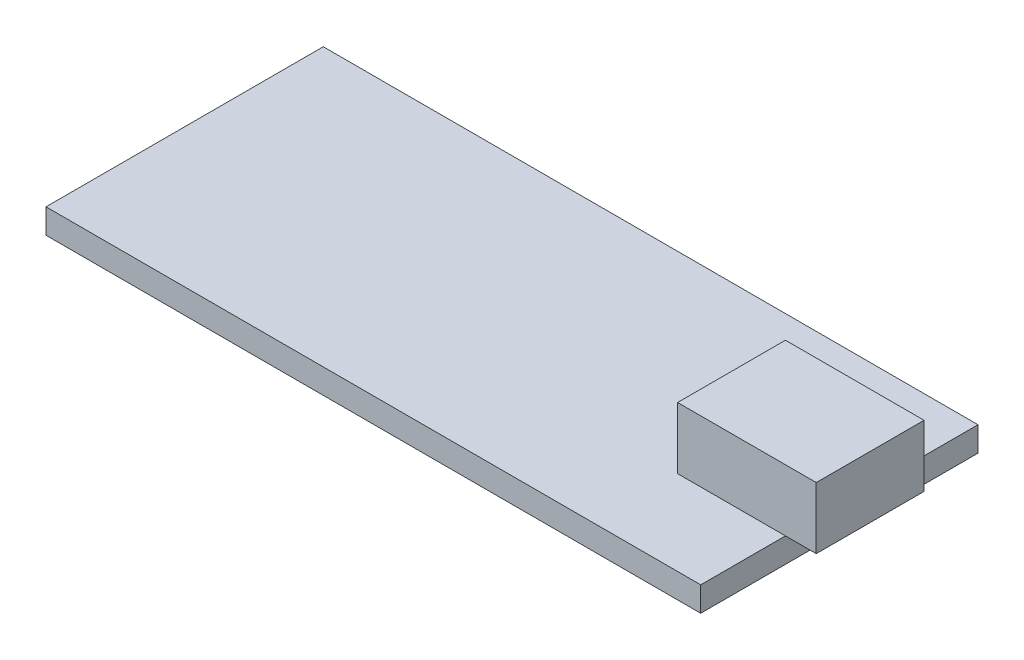
ISO-10303-21;
HEADER;
FILE_DESCRIPTION(('STEP AP214'),'2;1');
FILE_NAME('part.step','',(''),(''),'','','');
FILE_SCHEMA(('AUTOMOTIVE_DESIGN { 1 0 10303 214 1 1 1 1 }'));
ENDSEC;
DATA;
#1=APPLICATION_CONTEXT('core data for automotive mechanical design processes');
#2=APPLICATION_PROTOCOL_DEFINITION('international standard','automotive_design',2000,#1);
#3=PRODUCT_CONTEXT('',#1,'mechanical');
#4=PRODUCT('Part','Part','',(#3));
#5=PRODUCT_RELATED_PRODUCT_CATEGORY('part','',(#4));
#6=PRODUCT_DEFINITION_FORMATION('','',#4);
#7=PRODUCT_DEFINITION_CONTEXT('part definition',#1,'design');
#8=PRODUCT_DEFINITION('design','',#6,#7);
#9=PRODUCT_DEFINITION_SHAPE('','',#8);
#10=(LENGTH_UNIT() NAMED_UNIT(*) SI_UNIT(.MILLI.,.METRE.));
#11=(NAMED_UNIT(*) PLANE_ANGLE_UNIT() SI_UNIT($,.RADIAN.));
#12=(NAMED_UNIT(*) SI_UNIT($,.STERADIAN.) SOLID_ANGLE_UNIT());
#13=UNCERTAINTY_MEASURE_WITH_UNIT(LENGTH_MEASURE(1.E-05),#10,'distance_accuracy_value','');
#14=(GEOMETRIC_REPRESENTATION_CONTEXT(3) GLOBAL_UNCERTAINTY_ASSIGNED_CONTEXT((#13)) GLOBAL_UNIT_ASSIGNED_CONTEXT((#10,
#11,#12)) REPRESENTATION_CONTEXT('',''));
#15=CARTESIAN_POINT('',(0.,0.,0.));
#16=DIRECTION('',(0.,0.,1.));
#17=DIRECTION('',(1.,0.,0.));
#18=AXIS2_PLACEMENT_3D('',#15,#16,#17);
#19=CARTESIAN_POINT('',(0.,0.,0.));
#20=DIRECTION('',(0.,-1.,0.));
#21=DIRECTION('',(0.,0.,-1.));
#22=AXIS2_PLACEMENT_3D('',#19,#20,#21);
#23=PLANE('',#22);
#24=DIRECTION('',(1.,0.,0.));
#25=VECTOR('',#24,1.);
#26=CARTESIAN_POINT('',(21.25,0.,3.5));
#27=LINE('',#26,#25);
#28=CARTESIAN_POINT('',(14.25,0.,3.5));
#29=VERTEX_POINT('',#28);
#30=CARTESIAN_POINT('',(21.25,0.,3.5));
#31=VERTEX_POINT('',#30);
#32=EDGE_CURVE('E57',#29,#31,#27,.T.);
#33=ORIENTED_EDGE('',*,*,#32,.F.);
#34=DIRECTION('',(0.,0.,1.));
#35=VECTOR('',#34,1.);
#36=CARTESIAN_POINT('',(14.25,0.,-3.5));
#37=LINE('',#36,#35);
#38=CARTESIAN_POINT('',(14.25,0.,-3.5));
#39=VERTEX_POINT('',#38);
#40=EDGE_CURVE('E188',#39,#29,#37,.T.);
#41=ORIENTED_EDGE('',*,*,#40,.F.);
#42=DIRECTION('',(-1.,0.,0.));
#43=VECTOR('',#42,1.);
#44=CARTESIAN_POINT('',(21.25,0.,-3.5));
#45=LINE('',#44,#43);
#46=CARTESIAN_POINT('',(21.25,0.,-3.5));
#47=VERTEX_POINT('',#46);
#48=EDGE_CURVE('E11',#47,#39,#45,.T.);
#49=ORIENTED_EDGE('',*,*,#48,.F.);
#50=DIRECTION('',(0.,0.,-1.));
#51=VECTOR('',#50,1.);
#52=CARTESIAN_POINT('',(21.25,0.,9.));
#53=LINE('',#52,#51);
#54=CARTESIAN_POINT('',(21.25,0.,-9.));
#55=VERTEX_POINT('',#54);
#56=EDGE_CURVE('E136',#47,#55,#53,.T.);
#57=ORIENTED_EDGE('',*,*,#56,.T.);
#58=DIRECTION('',(-1.,0.,0.));
#59=VECTOR('',#58,1.);
#60=CARTESIAN_POINT('',(-21.25,0.,-9.));
#61=LINE('',#60,#59);
#62=CARTESIAN_POINT('',(-21.25,0.,-9.));
#63=VERTEX_POINT('',#62);
#64=EDGE_CURVE('E158',#55,#63,#61,.T.);
#65=ORIENTED_EDGE('',*,*,#64,.T.);
#66=DIRECTION('',(0.,0.,1.));
#67=VECTOR('',#66,1.);
#68=CARTESIAN_POINT('',(-21.25,0.,9.));
#69=LINE('',#68,#67);
#70=CARTESIAN_POINT('',(-21.25,0.,9.));
#71=VERTEX_POINT('',#70);
#72=EDGE_CURVE('E161',#63,#71,#69,.T.);
#73=ORIENTED_EDGE('',*,*,#72,.T.);
#74=DIRECTION('',(1.,0.,0.));
#75=VECTOR('',#74,1.);
#76=CARTESIAN_POINT('',(-21.25,0.,9.));
#77=LINE('',#76,#75);
#78=CARTESIAN_POINT('',(21.25,0.,9.));
#79=VERTEX_POINT('',#78);
#80=EDGE_CURVE('E149',#71,#79,#77,.T.);
#81=ORIENTED_EDGE('',*,*,#80,.T.);
#82=EDGE_CURVE('E140',#79,#31,#53,.T.);
#83=ORIENTED_EDGE('',*,*,#82,.T.);
#84=EDGE_LOOP('',(#33,#41,#49,#57,#65,#73,#81,#83));
#85=FACE_BOUND('',#84,.T.);
#86=ADVANCED_FACE('F39',(#85),#23,.F.);
#87=CARTESIAN_POINT('',(21.25,-1.6,9.));
#88=DIRECTION('',(1.,0.,0.));
#89=DIRECTION('',(0.,0.,-1.));
#90=AXIS2_PLACEMENT_3D('',#87,#88,#89);
#91=PLANE('',#90);
#92=ORIENTED_EDGE('',*,*,#82,.F.);
#93=DIRECTION('',(0.,1.,0.));
#94=VECTOR('',#93,1.);
#95=CARTESIAN_POINT('',(21.25,-1.6,9.));
#96=LINE('',#95,#94);
#97=CARTESIAN_POINT('',(21.25,-1.6,9.));
#98=VERTEX_POINT('',#97);
#99=EDGE_CURVE('E48',#98,#79,#96,.T.);
#100=ORIENTED_EDGE('',*,*,#99,.F.);
#101=DIRECTION('',(0.,0.,-1.));
#102=VECTOR('',#101,1.);
#103=CARTESIAN_POINT('',(21.25,-1.6,9.));
#104=LINE('',#103,#102);
#105=CARTESIAN_POINT('',(21.25,-1.6,-9.));
#106=VERTEX_POINT('',#105);
#107=EDGE_CURVE('E145',#98,#106,#104,.T.);
#108=ORIENTED_EDGE('',*,*,#107,.T.);
#109=DIRECTION('',(0.,1.,0.));
#110=VECTOR('',#109,1.);
#111=CARTESIAN_POINT('',(21.25,-1.6,-9.));
#112=LINE('',#111,#110);
#113=EDGE_CURVE('E43',#106,#55,#112,.T.);
#114=ORIENTED_EDGE('',*,*,#113,.T.);
#115=ORIENTED_EDGE('',*,*,#56,.F.);
#116=EDGE_CURVE('E138',#31,#47,#53,.T.);
#117=ORIENTED_EDGE('',*,*,#116,.F.);
#118=EDGE_LOOP('',(#92,#100,#108,#114,#115,#117));
#119=FACE_BOUND('',#118,.T.);
#120=ADVANCED_FACE('F41',(#119),#91,.T.);
#121=CARTESIAN_POINT('',(-21.25,-1.6,9.));
#122=DIRECTION('',(0.,0.,1.));
#123=DIRECTION('',(1.,0.,0.));
#124=AXIS2_PLACEMENT_3D('',#121,#122,#123);
#125=PLANE('',#124);
#126=ORIENTED_EDGE('',*,*,#80,.F.);
#127=DIRECTION('',(0.,1.,0.));
#128=VECTOR('',#127,1.);
#129=CARTESIAN_POINT('',(-21.25,-1.6,9.));
#130=LINE('',#129,#128);
#131=CARTESIAN_POINT('',(-21.25,-1.6,9.));
#132=VERTEX_POINT('',#131);
#133=EDGE_CURVE('E167',#132,#71,#130,.T.);
#134=ORIENTED_EDGE('',*,*,#133,.F.);
#135=DIRECTION('',(1.,0.,0.));
#136=VECTOR('',#135,1.);
#137=CARTESIAN_POINT('',(-21.25,-1.6,9.));
#138=LINE('',#137,#136);
#139=EDGE_CURVE('E155',#132,#98,#138,.T.);
#140=ORIENTED_EDGE('',*,*,#139,.T.);
#141=ORIENTED_EDGE('',*,*,#99,.T.);
#142=EDGE_LOOP('',(#126,#134,#140,#141));
#143=FACE_BOUND('',#142,.T.);
#144=ADVANCED_FACE('F182',(#143),#125,.T.);
#145=CARTESIAN_POINT('',(-21.25,-1.6,9.));
#146=DIRECTION('',(-1.,0.,0.));
#147=DIRECTION('',(0.,0.,1.));
#148=AXIS2_PLACEMENT_3D('',#145,#146,#147);
#149=PLANE('',#148);
#150=ORIENTED_EDGE('',*,*,#72,.F.);
#151=DIRECTION('',(0.,1.,0.));
#152=VECTOR('',#151,1.);
#153=CARTESIAN_POINT('',(-21.25,-1.6,-9.));
#154=LINE('',#153,#152);
#155=CARTESIAN_POINT('',(-21.25,-1.6,-9.));
#156=VERTEX_POINT('',#155);
#157=EDGE_CURVE('E168',#156,#63,#154,.T.);
#158=ORIENTED_EDGE('',*,*,#157,.F.);
#159=DIRECTION('',(0.,0.,1.));
#160=VECTOR('',#159,1.);
#161=CARTESIAN_POINT('',(-21.25,-1.6,9.));
#162=LINE('',#161,#160);
#163=EDGE_CURVE('E152',#156,#132,#162,.T.);
#164=ORIENTED_EDGE('',*,*,#163,.T.);
#165=ORIENTED_EDGE('',*,*,#133,.T.);
#166=EDGE_LOOP('',(#150,#158,#164,#165));
#167=FACE_BOUND('',#166,.T.);
#168=ADVANCED_FACE('F221',(#167),#149,.T.);
#169=CARTESIAN_POINT('',(-21.25,-1.6,-9.));
#170=DIRECTION('',(0.,0.,-1.));
#171=DIRECTION('',(-1.,0.,0.));
#172=AXIS2_PLACEMENT_3D('',#169,#170,#171);
#173=PLANE('',#172);
#174=ORIENTED_EDGE('',*,*,#64,.F.);
#175=ORIENTED_EDGE('',*,*,#113,.F.);
#176=DIRECTION('',(-1.,0.,0.));
#177=VECTOR('',#176,1.);
#178=CARTESIAN_POINT('',(-21.25,-1.6,-9.));
#179=LINE('',#178,#177);
#180=EDGE_CURVE('E148',#106,#156,#179,.T.);
#181=ORIENTED_EDGE('',*,*,#180,.T.);
#182=ORIENTED_EDGE('',*,*,#157,.T.);
#183=EDGE_LOOP('',(#174,#175,#181,#182));
#184=FACE_BOUND('',#183,.T.);
#185=ADVANCED_FACE('F178',(#184),#173,.T.);
#186=CARTESIAN_POINT('',(0.,-1.6,0.));
#187=DIRECTION('',(0.,-1.,0.));
#188=DIRECTION('',(0.,0.,-1.));
#189=AXIS2_PLACEMENT_3D('',#186,#187,#188);
#190=PLANE('',#189);
#191=ORIENTED_EDGE('',*,*,#107,.F.);
#192=ORIENTED_EDGE('',*,*,#139,.F.);
#193=ORIENTED_EDGE('',*,*,#163,.F.);
#194=ORIENTED_EDGE('',*,*,#180,.F.);
#195=EDGE_LOOP('',(#191,#192,#193,#194));
#196=FACE_BOUND('',#195,.T.);
#197=ADVANCED_FACE('F209',(#196),#190,.T.);
#198=CARTESIAN_POINT('',(23.25,4.,-3.5));
#199=DIRECTION('',(-1.,0.,0.));
#200=DIRECTION('',(0.,0.,1.));
#201=AXIS2_PLACEMENT_3D('',#198,#199,#200);
#202=PLANE('',#201);
#203=DIRECTION('',(0.,0.,-1.));
#204=VECTOR('',#203,1.);
#205=CARTESIAN_POINT('',(23.25,0.,-3.5));
#206=LINE('',#205,#204);
#207=CARTESIAN_POINT('',(23.25,0.,3.5));
#208=VERTEX_POINT('',#207);
#209=CARTESIAN_POINT('',(23.25,0.,-3.5));
#210=VERTEX_POINT('',#209);
#211=EDGE_CURVE('E187',#208,#210,#206,.T.);
#212=ORIENTED_EDGE('',*,*,#211,.T.);
#213=DIRECTION('',(0.,-1.,0.));
#214=VECTOR('',#213,1.);
#215=CARTESIAN_POINT('',(23.25,4.,-3.5));
#216=LINE('',#215,#214);
#217=CARTESIAN_POINT('',(23.25,4.,-3.5));
#218=VERTEX_POINT('',#217);
#219=EDGE_CURVE('E118',#218,#210,#216,.T.);
#220=ORIENTED_EDGE('',*,*,#219,.F.);
#221=DIRECTION('',(0.,0.,-1.));
#222=VECTOR('',#221,1.);
#223=CARTESIAN_POINT('',(23.25,4.,-3.5));
#224=LINE('',#223,#222);
#225=CARTESIAN_POINT('',(23.25,4.,3.5));
#226=VERTEX_POINT('',#225);
#227=EDGE_CURVE('E111',#226,#218,#224,.T.);
#228=ORIENTED_EDGE('',*,*,#227,.F.);
#229=DIRECTION('',(0.,-1.,0.));
#230=VECTOR('',#229,1.);
#231=CARTESIAN_POINT('',(23.25,4.,3.5));
#232=LINE('',#231,#230);
#233=EDGE_CURVE('E116',#226,#208,#232,.T.);
#234=ORIENTED_EDGE('',*,*,#233,.T.);
#235=EDGE_LOOP('',(#212,#220,#228,#234));
#236=FACE_BOUND('',#235,.T.);
#237=ADVANCED_FACE('F114',(#236),#202,.F.);
#238=CARTESIAN_POINT('',(21.25,4.,-3.5));
#239=DIRECTION('',(0.,0.,1.));
#240=DIRECTION('',(1.,0.,0.));
#241=AXIS2_PLACEMENT_3D('',#238,#239,#240);
#242=PLANE('',#241);
#243=EDGE_CURVE('E50',#210,#47,#45,.T.);
#244=ORIENTED_EDGE('',*,*,#243,.T.);
#245=ORIENTED_EDGE('',*,*,#48,.T.);
#246=DIRECTION('',(0.,-1.,0.));
#247=VECTOR('',#246,1.);
#248=CARTESIAN_POINT('',(14.25,4.,-3.5));
#249=LINE('',#248,#247);
#250=CARTESIAN_POINT('',(14.25,4.,-3.5));
#251=VERTEX_POINT('',#250);
#252=EDGE_CURVE('E141',#251,#39,#249,.T.);
#253=ORIENTED_EDGE('',*,*,#252,.F.);
#254=DIRECTION('',(-1.,0.,0.));
#255=VECTOR('',#254,1.);
#256=CARTESIAN_POINT('',(21.25,4.,-3.5));
#257=LINE('',#256,#255);
#258=EDGE_CURVE('E121',#218,#251,#257,.T.);
#259=ORIENTED_EDGE('',*,*,#258,.F.);
#260=ORIENTED_EDGE('',*,*,#219,.T.);
#261=EDGE_LOOP('',(#244,#245,#253,#259,#260));
#262=FACE_BOUND('',#261,.T.);
#263=ADVANCED_FACE('F198',(#262),#242,.F.);
#264=CARTESIAN_POINT('',(14.25,4.,-3.5));
#265=DIRECTION('',(1.,0.,0.));
#266=DIRECTION('',(0.,0.,-1.));
#267=AXIS2_PLACEMENT_3D('',#264,#265,#266);
#268=PLANE('',#267);
#269=ORIENTED_EDGE('',*,*,#40,.T.);
#270=DIRECTION('',(0.,-1.,0.));
#271=VECTOR('',#270,1.);
#272=CARTESIAN_POINT('',(14.25,4.,3.5));
#273=LINE('',#272,#271);
#274=CARTESIAN_POINT('',(14.25,4.,3.5));
#275=VERTEX_POINT('',#274);
#276=EDGE_CURVE('E190',#275,#29,#273,.T.);
#277=ORIENTED_EDGE('',*,*,#276,.F.);
#278=DIRECTION('',(0.,0.,1.));
#279=VECTOR('',#278,1.);
#280=CARTESIAN_POINT('',(14.25,4.,-3.5));
#281=LINE('',#280,#279);
#282=EDGE_CURVE('E127',#251,#275,#281,.T.);
#283=ORIENTED_EDGE('',*,*,#282,.F.);
#284=ORIENTED_EDGE('',*,*,#252,.T.);
#285=EDGE_LOOP('',(#269,#277,#283,#284));
#286=FACE_BOUND('',#285,.T.);
#287=ADVANCED_FACE('F196',(#286),#268,.F.);
#288=CARTESIAN_POINT('',(21.25,4.,3.5));
#289=DIRECTION('',(0.,0.,-1.));
#290=DIRECTION('',(-1.,0.,0.));
#291=AXIS2_PLACEMENT_3D('',#288,#289,#290);
#292=PLANE('',#291);
#293=ORIENTED_EDGE('',*,*,#32,.T.);
#294=EDGE_CURVE('E134',#31,#208,#27,.T.);
#295=ORIENTED_EDGE('',*,*,#294,.T.);
#296=ORIENTED_EDGE('',*,*,#233,.F.);
#297=DIRECTION('',(1.,0.,0.));
#298=VECTOR('',#297,1.);
#299=CARTESIAN_POINT('',(21.25,4.,3.5));
#300=LINE('',#299,#298);
#301=EDGE_CURVE('E122',#275,#226,#300,.T.);
#302=ORIENTED_EDGE('',*,*,#301,.F.);
#303=ORIENTED_EDGE('',*,*,#276,.T.);
#304=EDGE_LOOP('',(#293,#295,#296,#302,#303));
#305=FACE_BOUND('',#304,.T.);
#306=ADVANCED_FACE('F132',(#305),#292,.F.);
#307=CARTESIAN_POINT('',(0.,4.,0.));
#308=DIRECTION('',(0.,-1.,0.));
#309=DIRECTION('',(0.,0.,-1.));
#310=AXIS2_PLACEMENT_3D('',#307,#308,#309);
#311=PLANE('',#310);
#312=ORIENTED_EDGE('',*,*,#301,.T.);
#313=ORIENTED_EDGE('',*,*,#227,.T.);
#314=ORIENTED_EDGE('',*,*,#258,.T.);
#315=ORIENTED_EDGE('',*,*,#282,.T.);
#316=EDGE_LOOP('',(#312,#313,#314,#315));
#317=FACE_BOUND('',#316,.T.);
#318=ADVANCED_FACE('F125',(#317),#311,.F.);
#319=CARTESIAN_POINT('',(0.,0.,0.));
#320=DIRECTION('',(0.,-1.,0.));
#321=DIRECTION('',(0.,0.,-1.));
#322=AXIS2_PLACEMENT_3D('',#319,#320,#321);
#323=PLANE('',#322);
#324=ORIENTED_EDGE('',*,*,#294,.F.);
#325=ORIENTED_EDGE('',*,*,#116,.T.);
#326=ORIENTED_EDGE('',*,*,#243,.F.);
#327=ORIENTED_EDGE('',*,*,#211,.F.);
#328=EDGE_LOOP('',(#324,#325,#326,#327));
#329=FACE_BOUND('',#328,.T.);
#330=ADVANCED_FACE('F185',(#329),#323,.T.);
#331=CLOSED_SHELL('',(#86,#120,#144,#168,#185,#197,#237,#263,#287,#306,#318,#330));
#332=MANIFOLD_SOLID_BREP('B2',#331);
#333=ADVANCED_BREP_SHAPE_REPRESENTATION('',(#18,#332),#14);
#334=SHAPE_DEFINITION_REPRESENTATION(#9,#333);
ENDSEC;
END-ISO-10303-21;
